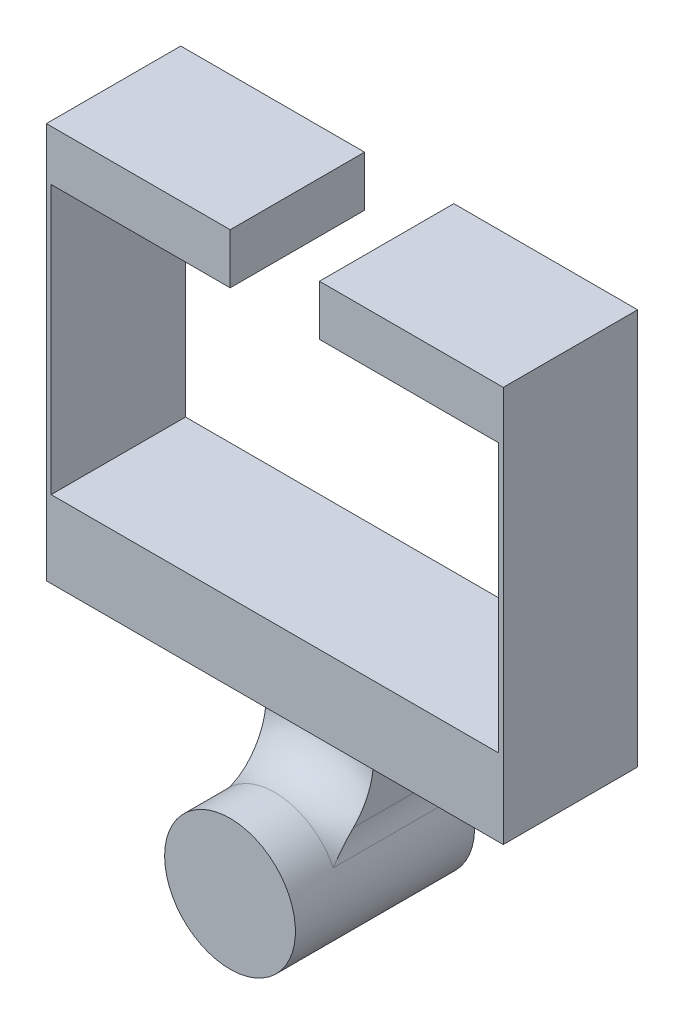
ISO-10303-21;
HEADER;
FILE_DESCRIPTION(('STEP AP214'),'2;1');
FILE_NAME('part.step','',(''),(''),'','','');
FILE_SCHEMA(('AUTOMOTIVE_DESIGN { 1 0 10303 214 1 1 1 1 }'));
ENDSEC;
DATA;
#1=APPLICATION_CONTEXT('core data for automotive mechanical design processes');
#2=APPLICATION_PROTOCOL_DEFINITION('international standard','automotive_design',2000,#1);
#3=PRODUCT_CONTEXT('',#1,'mechanical');
#4=PRODUCT('Part','Part','',(#3));
#5=PRODUCT_RELATED_PRODUCT_CATEGORY('part','',(#4));
#6=PRODUCT_DEFINITION_FORMATION('','',#4);
#7=PRODUCT_DEFINITION_CONTEXT('part definition',#1,'design');
#8=PRODUCT_DEFINITION('design','',#6,#7);
#9=PRODUCT_DEFINITION_SHAPE('','',#8);
#10=(LENGTH_UNIT() NAMED_UNIT(*) SI_UNIT(.MILLI.,.METRE.));
#11=(NAMED_UNIT(*) PLANE_ANGLE_UNIT() SI_UNIT($,.RADIAN.));
#12=(NAMED_UNIT(*) SI_UNIT($,.STERADIAN.) SOLID_ANGLE_UNIT());
#13=UNCERTAINTY_MEASURE_WITH_UNIT(LENGTH_MEASURE(1.E-05),#10,'distance_accuracy_value','');
#14=(GEOMETRIC_REPRESENTATION_CONTEXT(3) GLOBAL_UNCERTAINTY_ASSIGNED_CONTEXT((#13)) GLOBAL_UNIT_ASSIGNED_CONTEXT((#10,
#11,#12)) REPRESENTATION_CONTEXT('',''));
#15=CARTESIAN_POINT('',(0.,0.,0.));
#16=DIRECTION('',(0.,0.,1.));
#17=DIRECTION('',(1.,0.,0.));
#18=AXIS2_PLACEMENT_3D('',#15,#16,#17);
#19=CARTESIAN_POINT('',(-10.2322758787516,28.7391320706955,19.05));
#20=DIRECTION('',(0.,1.,0.));
#21=DIRECTION('',(0.,0.,1.));
#22=AXIS2_PLACEMENT_3D('',#19,#20,#21);
#23=PLANE('',#22);
#24=DIRECTION('',(0.,0.,-1.));
#25=VECTOR('',#24,1.);
#26=CARTESIAN_POINT('',(-50.2372758787516,28.7391320706955,0.));
#27=LINE('',#26,#25);
#28=CARTESIAN_POINT('',(-50.2372758787516,28.7391320706955,12.7));
#29=VERTEX_POINT('',#28);
#30=CARTESIAN_POINT('',(-50.2372758787516,28.7391320706955,0.));
#31=VERTEX_POINT('',#30);
#32=EDGE_CURVE('E212',#29,#31,#27,.T.);
#33=ORIENTED_EDGE('',*,*,#32,.F.);
#34=DIRECTION('',(-1.,0.,0.));
#35=VECTOR('',#34,1.);
#36=CARTESIAN_POINT('',(-50.2372758787516,28.7391320706955,12.7));
#37=LINE('',#36,#35);
#38=CARTESIAN_POINT('',(-34.9972758787516,28.7391320706955,12.7));
#39=VERTEX_POINT('',#38);
#40=EDGE_CURVE('E191',#39,#29,#37,.T.);
#41=ORIENTED_EDGE('',*,*,#40,.F.);
#42=DIRECTION('',(0.,0.,1.));
#43=VECTOR('',#42,1.);
#44=CARTESIAN_POINT('',(-34.9972758787516,28.7391320706955,0.));
#45=LINE('',#44,#43);
#46=CARTESIAN_POINT('',(-34.9972758787516,28.7391320706955,0.));
#47=VERTEX_POINT('',#46);
#48=EDGE_CURVE('E210',#47,#39,#45,.T.);
#49=ORIENTED_EDGE('',*,*,#48,.F.);
#50=DIRECTION('',(1.,0.,0.));
#51=VECTOR('',#50,1.);
#52=CARTESIAN_POINT('',(-10.2322758787516,28.7391320706955,0.));
#53=LINE('',#52,#51);
#54=CARTESIAN_POINT('',(-10.2322758787516,28.7391320706955,0.));
#55=VERTEX_POINT('',#54);
#56=EDGE_CURVE('E335',#47,#55,#53,.T.);
#57=ORIENTED_EDGE('',*,*,#56,.T.);
#58=DIRECTION('',(0.,0.,-1.));
#59=VECTOR('',#58,1.);
#60=CARTESIAN_POINT('',(-10.2322758787516,28.7391320706955,19.05));
#61=LINE('',#60,#59);
#62=CARTESIAN_POINT('',(-10.2322758787516,28.7391320706955,19.05));
#63=VERTEX_POINT('',#62);
#64=EDGE_CURVE('E354',#63,#55,#61,.T.);
#65=ORIENTED_EDGE('',*,*,#64,.F.);
#66=DIRECTION('',(1.,0.,0.));
#67=VECTOR('',#66,1.);
#68=CARTESIAN_POINT('',(-10.2322758787516,28.7391320706955,19.05));
#69=LINE('',#68,#67);
#70=CARTESIAN_POINT('',(-75.0022758787516,28.7391320706955,19.05));
#71=VERTEX_POINT('',#70);
#72=EDGE_CURVE('E316',#71,#63,#69,.T.);
#73=ORIENTED_EDGE('',*,*,#72,.F.);
#74=DIRECTION('',(0.,0.,-1.));
#75=VECTOR('',#74,1.);
#76=CARTESIAN_POINT('',(-75.0022758787516,28.7391320706955,19.05));
#77=LINE('',#76,#75);
#78=CARTESIAN_POINT('',(-75.0022758787516,28.7391320706955,0.));
#79=VERTEX_POINT('',#78);
#80=EDGE_CURVE('E357',#71,#79,#77,.T.);
#81=ORIENTED_EDGE('',*,*,#80,.T.);
#82=EDGE_CURVE('E337',#79,#31,#53,.T.);
#83=ORIENTED_EDGE('',*,*,#82,.T.);
#84=EDGE_LOOP('',(#33,#41,#49,#57,#65,#73,#81,#83));
#85=FACE_BOUND('',#84,.T.);
#86=ADVANCED_FACE('F47',(#85),#23,.F.);
#87=CARTESIAN_POINT('',(-75.0022758787516,84.8731320706955,19.05));
#88=DIRECTION('',(0.,-1.,0.));
#89=DIRECTION('',(0.,0.,-1.));
#90=AXIS2_PLACEMENT_3D('',#87,#88,#89);
#91=PLANE('',#90);
#92=DIRECTION('',(0.,0.,1.));
#93=VECTOR('',#92,1.);
#94=CARTESIAN_POINT('',(-48.9418758787516,84.8731320706955,0.));
#95=LINE('',#94,#93);
#96=CARTESIAN_POINT('',(-48.9418758787516,84.8731320706955,0.));
#97=VERTEX_POINT('',#96);
#98=CARTESIAN_POINT('',(-48.9418758787516,84.8731320706955,19.05));
#99=VERTEX_POINT('',#98);
#100=EDGE_CURVE('E295',#97,#99,#95,.T.);
#101=ORIENTED_EDGE('',*,*,#100,.F.);
#102=DIRECTION('',(-1.,0.,0.));
#103=VECTOR('',#102,1.);
#104=CARTESIAN_POINT('',(-75.0022758787516,84.8731320706955,0.));
#105=LINE('',#104,#103);
#106=CARTESIAN_POINT('',(-75.0022758787516,84.8731320706955,0.));
#107=VERTEX_POINT('',#106);
#108=EDGE_CURVE('E345',#97,#107,#105,.T.);
#109=ORIENTED_EDGE('',*,*,#108,.T.);
#110=DIRECTION('',(0.,0.,-1.));
#111=VECTOR('',#110,1.);
#112=CARTESIAN_POINT('',(-75.0022758787516,84.8731320706955,19.05));
#113=LINE('',#112,#111);
#114=CARTESIAN_POINT('',(-75.0022758787516,84.8731320706955,19.05));
#115=VERTEX_POINT('',#114);
#116=EDGE_CURVE('E331',#115,#107,#113,.T.);
#117=ORIENTED_EDGE('',*,*,#116,.F.);
#118=DIRECTION('',(-1.,0.,0.));
#119=VECTOR('',#118,1.);
#120=CARTESIAN_POINT('',(-75.0022758787516,84.8731320706955,19.05));
#121=LINE('',#120,#119);
#122=EDGE_CURVE('E327',#99,#115,#121,.T.);
#123=ORIENTED_EDGE('',*,*,#122,.F.);
#124=EDGE_LOOP('',(#101,#109,#117,#123));
#125=FACE_BOUND('',#124,.T.);
#126=ADVANCED_FACE('F465',(#125),#91,.F.);
#127=CARTESIAN_POINT('',(0.,0.,19.05));
#128=DIRECTION('',(0.,0.,-1.));
#129=DIRECTION('',(-1.,0.,0.));
#130=AXIS2_PLACEMENT_3D('',#127,#128,#129);
#131=PLANE('',#130);
#132=DIRECTION('',(0.,1.,0.));
#133=VECTOR('',#132,1.);
#134=CARTESIAN_POINT('',(-36.2926758787516,77.7357320706955,19.05));
#135=LINE('',#134,#133);
#136=CARTESIAN_POINT('',(-36.2926758787516,77.7357320706955,19.05));
#137=VERTEX_POINT('',#136);
#138=CARTESIAN_POINT('',(-36.2926758787516,84.8731320706955,19.05));
#139=VERTEX_POINT('',#138);
#140=EDGE_CURVE('E281',#137,#139,#135,.T.);
#141=ORIENTED_EDGE('',*,*,#140,.F.);
#142=DIRECTION('',(-1.,0.,0.));
#143=VECTOR('',#142,1.);
#144=CARTESIAN_POINT('',(-10.9129958787516,77.7357320706955,19.05));
#145=LINE('',#144,#143);
#146=CARTESIAN_POINT('',(-10.9129958787516,77.7357320706955,19.05));
#147=VERTEX_POINT('',#146);
#148=EDGE_CURVE('E278',#147,#137,#145,.T.);
#149=ORIENTED_EDGE('',*,*,#148,.F.);
#150=DIRECTION('',(0.,1.,0.));
#151=VECTOR('',#150,1.);
#152=CARTESIAN_POINT('',(-10.9129958787516,39.6611320706956,19.05));
#153=LINE('',#152,#151);
#154=CARTESIAN_POINT('',(-10.9129958787516,39.6611320706956,19.05));
#155=VERTEX_POINT('',#154);
#156=EDGE_CURVE('E277',#155,#147,#153,.T.);
#157=ORIENTED_EDGE('',*,*,#156,.F.);
#158=DIRECTION('',(1.,0.,0.));
#159=VECTOR('',#158,1.);
#160=CARTESIAN_POINT('',(-74.3215558787516,39.6611320706956,19.05));
#161=LINE('',#160,#159);
#162=CARTESIAN_POINT('',(-74.3215558787516,39.6611320706956,19.05));
#163=VERTEX_POINT('',#162);
#164=EDGE_CURVE('E275',#163,#155,#161,.T.);
#165=ORIENTED_EDGE('',*,*,#164,.F.);
#166=DIRECTION('',(0.,-1.,0.));
#167=VECTOR('',#166,1.);
#168=CARTESIAN_POINT('',(-74.3215558787516,39.6611320706956,19.05));
#169=LINE('',#168,#167);
#170=CARTESIAN_POINT('',(-74.3215558787516,77.7357320706955,19.05));
#171=VERTEX_POINT('',#170);
#172=EDGE_CURVE('E269',#171,#163,#169,.T.);
#173=ORIENTED_EDGE('',*,*,#172,.F.);
#174=DIRECTION('',(-1.,0.,0.));
#175=VECTOR('',#174,1.);
#176=CARTESIAN_POINT('',(-74.3215558787516,77.7357320706955,19.05));
#177=LINE('',#176,#175);
#178=CARTESIAN_POINT('',(-48.9418758787516,77.7357320706955,19.05));
#179=VERTEX_POINT('',#178);
#180=EDGE_CURVE('E234',#179,#171,#177,.T.);
#181=ORIENTED_EDGE('',*,*,#180,.F.);
#182=DIRECTION('',(0.,-1.,0.));
#183=VECTOR('',#182,1.);
#184=CARTESIAN_POINT('',(-48.9418758787516,77.7357320706955,19.05));
#185=LINE('',#184,#183);
#186=EDGE_CURVE('E239',#99,#179,#185,.T.);
#187=ORIENTED_EDGE('',*,*,#186,.F.);
#188=ORIENTED_EDGE('',*,*,#122,.T.);
#189=DIRECTION('',(0.,-1.,0.));
#190=VECTOR('',#189,1.);
#191=CARTESIAN_POINT('',(-75.0022758787516,28.7391320706955,19.05));
#192=LINE('',#191,#190);
#193=EDGE_CURVE('E314',#115,#71,#192,.T.);
#194=ORIENTED_EDGE('',*,*,#193,.T.);
#195=ORIENTED_EDGE('',*,*,#72,.T.);
#196=DIRECTION('',(0.,1.,0.));
#197=VECTOR('',#196,1.);
#198=CARTESIAN_POINT('',(-10.2322758787516,84.8731320706955,19.05));
#199=LINE('',#198,#197);
#200=CARTESIAN_POINT('',(-10.2322758787516,84.8731320706955,19.05));
#201=VERTEX_POINT('',#200);
#202=EDGE_CURVE('E324',#63,#201,#199,.T.);
#203=ORIENTED_EDGE('',*,*,#202,.T.);
#204=EDGE_CURVE('E329',#201,#139,#121,.T.);
#205=ORIENTED_EDGE('',*,*,#204,.T.);
#206=EDGE_LOOP('',(#141,#149,#157,#165,#173,#181,#187,#188,#194,#195,#203,#205));
#207=FACE_BOUND('',#206,.T.);
#208=ADVANCED_FACE('F444',(#207),#131,.F.);
#209=CARTESIAN_POINT('',(0.,0.,0.));
#210=DIRECTION('',(0.,0.,-1.));
#211=DIRECTION('',(-1.,0.,0.));
#212=AXIS2_PLACEMENT_3D('',#209,#210,#211);
#213=PLANE('',#212);
#214=DIRECTION('',(0.,1.,0.));
#215=VECTOR('',#214,1.);
#216=CARTESIAN_POINT('',(-34.9972758787516,9.68913207069554,0.));
#217=LINE('',#216,#215);
#218=CARTESIAN_POINT('',(-34.9972758787516,16.6787487268506,0.));
#219=VERTEX_POINT('',#218);
#220=EDGE_CURVE('E201',#219,#47,#217,.T.);
#221=ORIENTED_EDGE('',*,*,#220,.F.);
#222=CARTESIAN_POINT('',(-28.6472758787516,16.6787487268506,0.));
#223=DIRECTION('',(0.,0.,-1.));
#224=DIRECTION('',(-1.,0.,0.));
#225=AXIS2_PLACEMENT_3D('',#222,#223,#224);
#226=CIRCLE('',#225,6.35);
#227=CARTESIAN_POINT('',(-34.3261376673695,13.8374411430477,0.));
#228=VERTEX_POINT('',#227);
#229=EDGE_CURVE('E11',#219,#228,#226,.F.);
#230=ORIENTED_EDGE('',*,*,#229,.T.);
#231=CARTESIAN_POINT('',(-42.6172758787516,9.68913207069554,0.));
#232=DIRECTION('',(0.,0.,-1.));
#233=DIRECTION('',(-1.,0.,0.));
#234=AXIS2_PLACEMENT_3D('',#231,#232,#233);
#235=CIRCLE('',#234,9.271);
#236=CARTESIAN_POINT('',(-50.9084140901337,13.8374411430477,0.));
#237=VERTEX_POINT('',#236);
#238=EDGE_CURVE('E221',#228,#237,#235,.T.);
#239=ORIENTED_EDGE('',*,*,#238,.T.);
#240=CARTESIAN_POINT('',(-56.5872758787516,16.6787487268506,0.));
#241=DIRECTION('',(0.,0.,-1.));
#242=DIRECTION('',(-1.,0.,0.));
#243=AXIS2_PLACEMENT_3D('',#240,#241,#242);
#244=CIRCLE('',#243,6.35);
#245=CARTESIAN_POINT('',(-50.2372758787516,16.6787487268506,0.));
#246=VERTEX_POINT('',#245);
#247=EDGE_CURVE('E376',#237,#246,#244,.F.);
#248=ORIENTED_EDGE('',*,*,#247,.T.);
#249=DIRECTION('',(0.,1.,0.));
#250=VECTOR('',#249,1.);
#251=CARTESIAN_POINT('',(-50.2372758787516,9.68913207069554,0.));
#252=LINE('',#251,#250);
#253=EDGE_CURVE('E227',#246,#31,#252,.T.);
#254=ORIENTED_EDGE('',*,*,#253,.T.);
#255=ORIENTED_EDGE('',*,*,#82,.F.);
#256=DIRECTION('',(0.,-1.,0.));
#257=VECTOR('',#256,1.);
#258=CARTESIAN_POINT('',(-75.0022758787516,28.7391320706955,0.));
#259=LINE('',#258,#257);
#260=EDGE_CURVE('E291',#107,#79,#259,.T.);
#261=ORIENTED_EDGE('',*,*,#260,.F.);
#262=ORIENTED_EDGE('',*,*,#108,.F.);
#263=DIRECTION('',(0.,-1.,0.));
#264=VECTOR('',#263,1.);
#265=CARTESIAN_POINT('',(-48.9418758787516,77.7357320706955,0.));
#266=LINE('',#265,#264);
#267=CARTESIAN_POINT('',(-48.9418758787516,77.7357320706955,0.));
#268=VERTEX_POINT('',#267);
#269=EDGE_CURVE('E258',#97,#268,#266,.T.);
#270=ORIENTED_EDGE('',*,*,#269,.T.);
#271=DIRECTION('',(-1.,0.,0.));
#272=VECTOR('',#271,1.);
#273=CARTESIAN_POINT('',(-74.3215558787516,77.7357320706955,0.));
#274=LINE('',#273,#272);
#275=CARTESIAN_POINT('',(-74.3215558787516,77.7357320706955,0.));
#276=VERTEX_POINT('',#275);
#277=EDGE_CURVE('E232',#268,#276,#274,.T.);
#278=ORIENTED_EDGE('',*,*,#277,.T.);
#279=DIRECTION('',(0.,-1.,0.));
#280=VECTOR('',#279,1.);
#281=CARTESIAN_POINT('',(-74.3215558787516,39.6611320706956,0.));
#282=LINE('',#281,#280);
#283=CARTESIAN_POINT('',(-74.3215558787516,39.6611320706956,0.));
#284=VERTEX_POINT('',#283);
#285=EDGE_CURVE('E237',#276,#284,#282,.T.);
#286=ORIENTED_EDGE('',*,*,#285,.T.);
#287=DIRECTION('',(1.,0.,0.));
#288=VECTOR('',#287,1.);
#289=CARTESIAN_POINT('',(-74.3215558787516,39.6611320706956,0.));
#290=LINE('',#289,#288);
#291=CARTESIAN_POINT('',(-10.9129958787516,39.6611320706956,0.));
#292=VERTEX_POINT('',#291);
#293=EDGE_CURVE('E242',#284,#292,#290,.T.);
#294=ORIENTED_EDGE('',*,*,#293,.T.);
#295=DIRECTION('',(0.,1.,0.));
#296=VECTOR('',#295,1.);
#297=CARTESIAN_POINT('',(-10.9129958787516,39.6611320706956,0.));
#298=LINE('',#297,#296);
#299=CARTESIAN_POINT('',(-10.9129958787516,77.7357320706955,0.));
#300=VERTEX_POINT('',#299);
#301=EDGE_CURVE('E247',#292,#300,#298,.T.);
#302=ORIENTED_EDGE('',*,*,#301,.T.);
#303=DIRECTION('',(-1.,0.,0.));
#304=VECTOR('',#303,1.);
#305=CARTESIAN_POINT('',(-10.9129958787516,77.7357320706955,0.));
#306=LINE('',#305,#304);
#307=CARTESIAN_POINT('',(-36.2926758787516,77.7357320706955,0.));
#308=VERTEX_POINT('',#307);
#309=EDGE_CURVE('E255',#300,#308,#306,.T.);
#310=ORIENTED_EDGE('',*,*,#309,.T.);
#311=DIRECTION('',(0.,1.,0.));
#312=VECTOR('',#311,1.);
#313=CARTESIAN_POINT('',(-36.2926758787516,77.7357320706955,0.));
#314=LINE('',#313,#312);
#315=CARTESIAN_POINT('',(-36.2926758787516,84.8731320706955,0.));
#316=VERTEX_POINT('',#315);
#317=EDGE_CURVE('E257',#308,#316,#314,.T.);
#318=ORIENTED_EDGE('',*,*,#317,.T.);
#319=CARTESIAN_POINT('',(-10.2322758787516,84.8731320706955,0.));
#320=VERTEX_POINT('',#319);
#321=EDGE_CURVE('E318',#320,#316,#105,.T.);
#322=ORIENTED_EDGE('',*,*,#321,.F.);
#323=DIRECTION('',(0.,1.,0.));
#324=VECTOR('',#323,1.);
#325=CARTESIAN_POINT('',(-10.2322758787516,84.8731320706955,0.));
#326=LINE('',#325,#324);
#327=EDGE_CURVE('E339',#55,#320,#326,.T.);
#328=ORIENTED_EDGE('',*,*,#327,.F.);
#329=ORIENTED_EDGE('',*,*,#56,.F.);
#330=EDGE_LOOP('',(#221,#230,#239,#248,#254,#255,#261,#262,#270,#278,#286,#294,#302,#310,#318,
#322,#328,#329));
#331=FACE_BOUND('',#330,.T.);
#332=ADVANCED_FACE('F424',(#331),#213,.T.);
#333=CARTESIAN_POINT('',(-75.0022758787516,28.7391320706955,19.05));
#334=DIRECTION('',(1.,0.,0.));
#335=DIRECTION('',(0.,0.,-1.));
#336=AXIS2_PLACEMENT_3D('',#333,#334,#335);
#337=PLANE('',#336);
#338=ORIENTED_EDGE('',*,*,#260,.T.);
#339=ORIENTED_EDGE('',*,*,#80,.F.);
#340=ORIENTED_EDGE('',*,*,#193,.F.);
#341=ORIENTED_EDGE('',*,*,#116,.T.);
#342=EDGE_LOOP('',(#338,#339,#340,#341));
#343=FACE_BOUND('',#342,.T.);
#344=ADVANCED_FACE('F402',(#343),#337,.F.);
#345=CARTESIAN_POINT('',(-10.2322758787516,84.8731320706955,19.05));
#346=DIRECTION('',(-1.,0.,0.));
#347=DIRECTION('',(0.,0.,1.));
#348=AXIS2_PLACEMENT_3D('',#345,#346,#347);
#349=PLANE('',#348);
#350=ORIENTED_EDGE('',*,*,#327,.T.);
#351=DIRECTION('',(0.,0.,-1.));
#352=VECTOR('',#351,1.);
#353=CARTESIAN_POINT('',(-10.2322758787516,84.8731320706955,19.05));
#354=LINE('',#353,#352);
#355=EDGE_CURVE('E346',#201,#320,#354,.T.);
#356=ORIENTED_EDGE('',*,*,#355,.F.);
#357=ORIENTED_EDGE('',*,*,#202,.F.);
#358=ORIENTED_EDGE('',*,*,#64,.T.);
#359=EDGE_LOOP('',(#350,#356,#357,#358));
#360=FACE_BOUND('',#359,.T.);
#361=ADVANCED_FACE('F436',(#360),#349,.F.);
#362=ORIENTED_EDGE('',*,*,#321,.T.);
#363=DIRECTION('',(0.,0.,1.));
#364=VECTOR('',#363,1.);
#365=CARTESIAN_POINT('',(-36.2926758787516,84.8731320706955,0.));
#366=LINE('',#365,#364);
#367=EDGE_CURVE('E300',#316,#139,#366,.T.);
#368=ORIENTED_EDGE('',*,*,#367,.T.);
#369=ORIENTED_EDGE('',*,*,#204,.F.);
#370=ORIENTED_EDGE('',*,*,#355,.T.);
#371=EDGE_LOOP('',(#362,#368,#369,#370));
#372=FACE_BOUND('',#371,.T.);
#373=ADVANCED_FACE('F441',(#372),#91,.F.);
#374=CARTESIAN_POINT('',(-74.3215558787516,77.7357320706955,0.));
#375=DIRECTION('',(0.,1.,0.));
#376=DIRECTION('',(0.,0.,1.));
#377=AXIS2_PLACEMENT_3D('',#374,#375,#376);
#378=PLANE('',#377);
#379=ORIENTED_EDGE('',*,*,#180,.T.);
#380=DIRECTION('',(0.,0.,1.));
#381=VECTOR('',#380,1.);
#382=CARTESIAN_POINT('',(-74.3215558787516,77.7357320706955,0.));
#383=LINE('',#382,#381);
#384=EDGE_CURVE('E261',#276,#171,#383,.T.);
#385=ORIENTED_EDGE('',*,*,#384,.F.);
#386=ORIENTED_EDGE('',*,*,#277,.F.);
#387=DIRECTION('',(0.,0.,1.));
#388=VECTOR('',#387,1.);
#389=CARTESIAN_POINT('',(-48.9418758787516,77.7357320706955,0.));
#390=LINE('',#389,#388);
#391=EDGE_CURVE('E290',#268,#179,#390,.T.);
#392=ORIENTED_EDGE('',*,*,#391,.T.);
#393=EDGE_LOOP('',(#379,#385,#386,#392));
#394=FACE_BOUND('',#393,.T.);
#395=ADVANCED_FACE('F479',(#394),#378,.F.);
#396=CARTESIAN_POINT('',(-48.9418758787516,77.7357320706955,0.));
#397=DIRECTION('',(-1.,0.,0.));
#398=DIRECTION('',(0.,0.,1.));
#399=AXIS2_PLACEMENT_3D('',#396,#397,#398);
#400=PLANE('',#399);
#401=ORIENTED_EDGE('',*,*,#186,.T.);
#402=ORIENTED_EDGE('',*,*,#391,.F.);
#403=ORIENTED_EDGE('',*,*,#269,.F.);
#404=ORIENTED_EDGE('',*,*,#100,.T.);
#405=EDGE_LOOP('',(#401,#402,#403,#404));
#406=FACE_BOUND('',#405,.T.);
#407=ADVANCED_FACE('F483',(#406),#400,.F.);
#408=CARTESIAN_POINT('',(-36.2926758787516,77.7357320706955,0.));
#409=DIRECTION('',(1.,0.,0.));
#410=DIRECTION('',(0.,0.,-1.));
#411=AXIS2_PLACEMENT_3D('',#408,#409,#410);
#412=PLANE('',#411);
#413=ORIENTED_EDGE('',*,*,#140,.T.);
#414=ORIENTED_EDGE('',*,*,#367,.F.);
#415=ORIENTED_EDGE('',*,*,#317,.F.);
#416=DIRECTION('',(0.,0.,1.));
#417=VECTOR('',#416,1.);
#418=CARTESIAN_POINT('',(-36.2926758787516,77.7357320706955,0.));
#419=LINE('',#418,#417);
#420=EDGE_CURVE('E301',#308,#137,#419,.T.);
#421=ORIENTED_EDGE('',*,*,#420,.T.);
#422=EDGE_LOOP('',(#413,#414,#415,#421));
#423=FACE_BOUND('',#422,.T.);
#424=ADVANCED_FACE('F499',(#423),#412,.F.);
#425=CARTESIAN_POINT('',(-10.9129958787516,77.7357320706955,0.));
#426=DIRECTION('',(0.,1.,0.));
#427=DIRECTION('',(0.,0.,1.));
#428=AXIS2_PLACEMENT_3D('',#425,#426,#427);
#429=PLANE('',#428);
#430=ORIENTED_EDGE('',*,*,#148,.T.);
#431=ORIENTED_EDGE('',*,*,#420,.F.);
#432=ORIENTED_EDGE('',*,*,#309,.F.);
#433=DIRECTION('',(0.,0.,1.));
#434=VECTOR('',#433,1.);
#435=CARTESIAN_POINT('',(-10.9129958787516,77.7357320706955,0.));
#436=LINE('',#435,#434);
#437=EDGE_CURVE('E302',#300,#147,#436,.T.);
#438=ORIENTED_EDGE('',*,*,#437,.T.);
#439=EDGE_LOOP('',(#430,#431,#432,#438));
#440=FACE_BOUND('',#439,.T.);
#441=ADVANCED_FACE('F496',(#440),#429,.F.);
#442=CARTESIAN_POINT('',(-10.9129958787516,39.6611320706956,0.));
#443=DIRECTION('',(1.,0.,0.));
#444=DIRECTION('',(0.,0.,-1.));
#445=AXIS2_PLACEMENT_3D('',#442,#443,#444);
#446=PLANE('',#445);
#447=ORIENTED_EDGE('',*,*,#156,.T.);
#448=ORIENTED_EDGE('',*,*,#437,.F.);
#449=ORIENTED_EDGE('',*,*,#301,.F.);
#450=DIRECTION('',(0.,0.,1.));
#451=VECTOR('',#450,1.);
#452=CARTESIAN_POINT('',(-10.9129958787516,39.6611320706956,0.));
#453=LINE('',#452,#451);
#454=EDGE_CURVE('E310',#292,#155,#453,.T.);
#455=ORIENTED_EDGE('',*,*,#454,.T.);
#456=EDGE_LOOP('',(#447,#448,#449,#455));
#457=FACE_BOUND('',#456,.T.);
#458=ADVANCED_FACE('F495',(#457),#446,.F.);
#459=CARTESIAN_POINT('',(-74.3215558787516,39.6611320706956,0.));
#460=DIRECTION('',(0.,-1.,0.));
#461=DIRECTION('',(0.,0.,-1.));
#462=AXIS2_PLACEMENT_3D('',#459,#460,#461);
#463=PLANE('',#462);
#464=ORIENTED_EDGE('',*,*,#164,.T.);
#465=ORIENTED_EDGE('',*,*,#454,.F.);
#466=ORIENTED_EDGE('',*,*,#293,.F.);
#467=DIRECTION('',(0.,0.,1.));
#468=VECTOR('',#467,1.);
#469=CARTESIAN_POINT('',(-74.3215558787516,39.6611320706956,0.));
#470=LINE('',#469,#468);
#471=EDGE_CURVE('E309',#284,#163,#470,.T.);
#472=ORIENTED_EDGE('',*,*,#471,.T.);
#473=EDGE_LOOP('',(#464,#465,#466,#472));
#474=FACE_BOUND('',#473,.T.);
#475=ADVANCED_FACE('F486',(#474),#463,.F.);
#476=CARTESIAN_POINT('',(-74.3215558787516,39.6611320706956,0.));
#477=DIRECTION('',(-1.,0.,0.));
#478=DIRECTION('',(0.,0.,1.));
#479=AXIS2_PLACEMENT_3D('',#476,#477,#478);
#480=PLANE('',#479);
#481=ORIENTED_EDGE('',*,*,#172,.T.);
#482=ORIENTED_EDGE('',*,*,#471,.F.);
#483=ORIENTED_EDGE('',*,*,#285,.F.);
#484=ORIENTED_EDGE('',*,*,#384,.T.);
#485=EDGE_LOOP('',(#481,#482,#483,#484));
#486=FACE_BOUND('',#485,.T.);
#487=ADVANCED_FACE('F488',(#486),#480,.F.);
#488=CARTESIAN_POINT('',(-34.9972758787516,9.68913207069554,0.));
#489=DIRECTION('',(-1.,0.,0.));
#490=DIRECTION('',(0.,0.,1.));
#491=AXIS2_PLACEMENT_3D('',#488,#489,#490);
#492=PLANE('',#491);
#493=CARTESIAN_POINT('',(-34.9972758787516,23.3255260588436,12.7));
#494=CARTESIAN_POINT('',(-34.9972758787516,23.0546321355945,12.6999788290273));
#495=CARTESIAN_POINT('',(-34.9972758787516,22.7838526435306,12.7132063184054));
#496=CARTESIAN_POINT('',(-34.9972758787516,22.2449042782785,12.7648273092837));
#497=CARTESIAN_POINT('',(-34.9972758787516,21.9767334930772,12.803200706323));
#498=CARTESIAN_POINT('',(-34.9972758787516,21.4450696170849,12.9037627512357));
#499=CARTESIAN_POINT('',(-34.9972758787516,21.1815743886563,12.9659402063028));
#500=CARTESIAN_POINT('',(-34.9972758787516,20.6608961173988,13.1127576440594));
#501=CARTESIAN_POINT('',(-34.9972758787516,20.4037139399197,13.1974006876012));
#502=CARTESIAN_POINT('',(-34.9972758787516,19.913776222446,13.3816466778445));
#503=CARTESIAN_POINT('',(-34.9972758787516,19.6805188653102,13.4799215790636));
#504=CARTESIAN_POINT('',(-34.9972758787516,19.2221823018147,13.6939966569016));
#505=CARTESIAN_POINT('',(-34.9972758787516,18.9971033824517,13.8097974478017));
#506=CARTESIAN_POINT('',(-34.9972758787516,18.5566558722049,14.0579344043023));
#507=CARTESIAN_POINT('',(-34.9972758787516,18.3412746890758,14.1902482331328));
#508=CARTESIAN_POINT('',(-34.9972758787516,17.9213118616131,14.4708916037341));
#509=CARTESIAN_POINT('',(-34.9972758787516,17.7167257486073,14.6192144398188));
#510=CARTESIAN_POINT('',(-34.9972758787516,17.3708588639981,14.8914797414496));
#511=CARTESIAN_POINT('',(-34.9972758787516,17.2268062231467,15.0119101167732));
#512=CARTESIAN_POINT('',(-34.9972758787516,16.9466487929082,15.2613205388803));
#513=CARTESIAN_POINT('',(-34.9972758787516,16.8105338864013,15.3902892343684));
#514=CARTESIAN_POINT('',(-34.9972758787516,16.6787487268506,15.523621196131));
#515=B_SPLINE_CURVE_WITH_KNOTS('',3,(#493,#494,#495,#496,#497,#498,#499,#500,#501,#502,#503,
#504,#505,#506,#507,#508,#509,#510,#511,#512,#513,#514),.UNSPECIFIED.,.F.,.F.,(4,2,2,2,2,2,2,2,
2,2,4),(0.,0.812193431689651,1.62373829576261,2.43490203447489,3.24617634798989,4.0047792486576,
4.7634087444633,5.52102296311216,6.27832106279377,6.84126734956655,7.40347969778935),.UNSPECIFIED.);
#516=CARTESIAN_POINT('',(-34.9972758787516,23.3255260588436,12.7));
#517=VERTEX_POINT('',#516);
#518=CARTESIAN_POINT('',(-34.9972758787516,16.6787487268506,15.523621196131));
#519=VERTEX_POINT('',#518);
#520=EDGE_CURVE('E378',#517,#519,#515,.T.);
#521=ORIENTED_EDGE('',*,*,#520,.T.);
#522=DIRECTION('',(0.,0.,-1.));
#523=VECTOR('',#522,1.);
#524=CARTESIAN_POINT('',(-34.9972758787516,16.6787487268506,0.));
#525=LINE('',#524,#523);
#526=EDGE_CURVE('E74',#519,#219,#525,.T.);
#527=ORIENTED_EDGE('',*,*,#526,.T.);
#528=ORIENTED_EDGE('',*,*,#220,.T.);
#529=ORIENTED_EDGE('',*,*,#48,.T.);
#530=DIRECTION('',(0.,1.,0.));
#531=VECTOR('',#530,1.);
#532=CARTESIAN_POINT('',(-34.9972758787516,9.68913207069554,12.7));
#533=LINE('',#532,#531);
#534=EDGE_CURVE('E188',#517,#39,#533,.T.);
#535=ORIENTED_EDGE('',*,*,#534,.F.);
#536=EDGE_LOOP('',(#521,#527,#528,#529,#535));
#537=FACE_BOUND('',#536,.T.);
#538=ADVANCED_FACE('F211',(#537),#492,.F.);
#539=CARTESIAN_POINT('',(-50.2372758787516,9.68913207069554,12.7));
#540=DIRECTION('',(0.,0.,-1.));
#541=DIRECTION('',(-1.,0.,0.));
#542=AXIS2_PLACEMENT_3D('',#539,#540,#541);
#543=PLANE('',#542);
#544=DIRECTION('',(0.,1.,0.));
#545=VECTOR('',#544,1.);
#546=CARTESIAN_POINT('',(-50.2372758787516,9.68913207069554,12.7));
#547=LINE('',#546,#545);
#548=CARTESIAN_POINT('',(-50.2372758787516,23.3255260588436,12.7));
#549=VERTEX_POINT('',#548);
#550=EDGE_CURVE('E202',#549,#29,#547,.T.);
#551=ORIENTED_EDGE('',*,*,#550,.F.);
#552=CARTESIAN_POINT('',(-42.6172758787516,9.68913207069554,12.7));
#553=DIRECTION('',(0.,0.,-1.));
#554=DIRECTION('',(-1.,0.,0.));
#555=AXIS2_PLACEMENT_3D('',#552,#553,#554);
#556=CIRCLE('',#555,15.621);
#557=EDGE_CURVE('E197',#549,#517,#556,.T.);
#558=ORIENTED_EDGE('',*,*,#557,.T.);
#559=ORIENTED_EDGE('',*,*,#534,.T.);
#560=ORIENTED_EDGE('',*,*,#40,.T.);
#561=EDGE_LOOP('',(#551,#558,#559,#560));
#562=FACE_BOUND('',#561,.T.);
#563=ADVANCED_FACE('F194',(#562),#543,.F.);
#564=CARTESIAN_POINT('',(-50.2372758787516,9.68913207069554,0.));
#565=DIRECTION('',(1.,0.,0.));
#566=DIRECTION('',(0.,0.,-1.));
#567=AXIS2_PLACEMENT_3D('',#564,#565,#566);
#568=PLANE('',#567);
#569=ORIENTED_EDGE('',*,*,#253,.F.);
#570=DIRECTION('',(0.,0.,-1.));
#571=VECTOR('',#570,1.);
#572=CARTESIAN_POINT('',(-50.2372758787516,16.6787487268506,0.));
#573=LINE('',#572,#571);
#574=CARTESIAN_POINT('',(-50.2372758787516,16.6787487268506,15.523621196131));
#575=VERTEX_POINT('',#574);
#576=EDGE_CURVE('E82',#246,#575,#573,.F.);
#577=ORIENTED_EDGE('',*,*,#576,.T.);
#578=CARTESIAN_POINT('',(-50.2372758787516,16.6787487268506,15.523621196131));
#579=CARTESIAN_POINT('',(-50.2372758787516,16.7734021785488,15.4278261411111));
#580=CARTESIAN_POINT('',(-50.2372758787516,16.8703182735625,15.3342880702086));
#581=CARTESIAN_POINT('',(-50.2372758787516,17.0682785837536,15.1517193439985));
#582=CARTESIAN_POINT('',(-50.2372758787516,17.1693220826402,15.0626879125406));
#583=CARTESIAN_POINT('',(-50.2372758787516,17.3751281763483,14.8891306286555));
#584=CARTESIAN_POINT('',(-50.2372758787516,17.4798891319186,14.8046028304448));
#585=CARTESIAN_POINT('',(-50.2372758787516,17.6928714796219,14.6400299743962));
#586=CARTESIAN_POINT('',(-50.2372758787516,17.801093057279,14.5599851575263));
#587=CARTESIAN_POINT('',(-50.2372758787516,18.1316476937774,14.3258582052204));
#588=CARTESIAN_POINT('',(-50.2372758787516,18.358880520139,14.1786151833996));
#589=CARTESIAN_POINT('',(-50.2372758787516,18.8245218783206,13.9030097698479));
#590=CARTESIAN_POINT('',(-50.2372758787516,19.0629321074188,13.7746502578856));
#591=CARTESIAN_POINT('',(-50.2372758787516,19.5483973734317,13.5382556757826));
#592=CARTESIAN_POINT('',(-50.2372758787516,19.7954116531375,13.4301370674651));
#593=CARTESIAN_POINT('',(-50.2372758787516,20.2975585362962,13.2347076614813));
#594=CARTESIAN_POINT('',(-50.2372758787516,20.552691198908,13.1473970154826));
#595=CARTESIAN_POINT('',(-50.2372758787516,21.0685704311247,12.9951375427789));
#596=CARTESIAN_POINT('',(-50.2372758787516,21.3292937979512,12.9301102618806));
#597=CARTESIAN_POINT('',(-50.2372758787516,21.8554232843219,12.8233343813328));
#598=CARTESIAN_POINT('',(-50.2372758787516,22.1208275522738,12.7815767810565));
#599=CARTESIAN_POINT('',(-50.2372758787516,22.5432677436248,12.7348863882157));
#600=CARTESIAN_POINT('',(-50.2372758787516,22.6994433457459,12.7218606617916));
#601=CARTESIAN_POINT('',(-50.2372758787516,23.0122437096881,12.7044179953703));
#602=CARTESIAN_POINT('',(-50.2372758787516,23.1688683833198,12.699999467445));
#603=CARTESIAN_POINT('',(-50.2372758787516,23.3255260588436,12.7));
#604=B_SPLINE_CURVE_WITH_KNOTS('',3,(#578,#579,#580,#581,#582,#583,#584,#585,#586,#587,#588,
#589,#590,#591,#592,#593,#594,#595,#596,#597,#598,#599,#600,#601,#602,#603),.UNSPECIFIED.,.F.,
.F.,(4,2,2,2,2,2,2,2,2,2,2,2,4),(0.,0.403948885387974,0.807827962822364,1.21153110626174,
1.61525592865209,2.42657274054092,3.23801315170087,4.04602696861303,4.85404667489603,
5.65919159061589,6.46402486270011,6.93396340352681,7.40381523794231),.UNSPECIFIED.);
#605=EDGE_CURVE('E63',#575,#549,#604,.T.);
#606=ORIENTED_EDGE('',*,*,#605,.T.);
#607=ORIENTED_EDGE('',*,*,#550,.T.);
#608=ORIENTED_EDGE('',*,*,#32,.T.);
#609=EDGE_LOOP('',(#569,#577,#606,#607,#608));
#610=FACE_BOUND('',#609,.T.);
#611=ADVANCED_FACE('F454',(#610),#568,.F.);
#612=CARTESIAN_POINT('',(-42.6172758787516,9.68913207069554,25.4));
#613=DIRECTION('',(0.,0.,-1.));
#614=DIRECTION('',(-1.,0.,0.));
#615=AXIS2_PLACEMENT_3D('',#612,#613,#614);
#616=CYLINDRICAL_SURFACE('',#615,9.271);
#617=CARTESIAN_POINT('',(-42.6172758787516,9.68913207069554,25.4));
#618=DIRECTION('',(0.,0.,-1.));
#619=DIRECTION('',(-1.,0.,0.));
#620=AXIS2_PLACEMENT_3D('',#617,#618,#619);
#621=CIRCLE('',#620,9.271);
#622=CARTESIAN_POINT('',(-51.8882758787516,9.68913207069554,25.4));
#623=VERTEX_POINT('',#622);
#624=EDGE_CURVE('E219',#623,#623,#621,.T.);
#625=ORIENTED_EDGE('',*,*,#624,.T.);
#626=EDGE_LOOP('',(#625));
#627=FACE_BOUND('',#626,.T.);
#628=CARTESIAN_POINT('',(-42.6172758787516,9.68913207069554,19.05));
#629=DIRECTION('',(0.,0.,-1.));
#630=DIRECTION('',(-1.,0.,0.));
#631=AXIS2_PLACEMENT_3D('',#628,#629,#630);
#632=CIRCLE('',#631,9.271);
#633=CARTESIAN_POINT('',(-34.3261376673695,13.8374411430477,19.05));
#634=VERTEX_POINT('',#633);
#635=CARTESIAN_POINT('',(-50.9084140901337,13.8374411430477,19.05));
#636=VERTEX_POINT('',#635);
#637=EDGE_CURVE('E366',#634,#636,#632,.F.);
#638=ORIENTED_EDGE('',*,*,#637,.T.);
#639=DIRECTION('',(0.,0.,-1.));
#640=VECTOR('',#639,1.);
#641=CARTESIAN_POINT('',(-50.9084140901337,13.8374411430477,25.4));
#642=LINE('',#641,#640);
#643=EDGE_CURVE('E367',#636,#237,#642,.T.);
#644=ORIENTED_EDGE('',*,*,#643,.T.);
#645=ORIENTED_EDGE('',*,*,#238,.F.);
#646=DIRECTION('',(0.,0.,-1.));
#647=VECTOR('',#646,1.);
#648=CARTESIAN_POINT('',(-34.3261376673695,13.8374411430477,25.4));
#649=LINE('',#648,#647);
#650=EDGE_CURVE('E361',#228,#634,#649,.F.);
#651=ORIENTED_EDGE('',*,*,#650,.T.);
#652=EDGE_LOOP('',(#638,#644,#645,#651));
#653=FACE_BOUND('',#652,.T.);
#654=ADVANCED_FACE('F453',(#627,#653),#616,.T.);
#655=CARTESIAN_POINT('',(-42.6172758787516,9.68913207069554,25.4));
#656=DIRECTION('',(0.,0.,-1.));
#657=DIRECTION('',(-1.,0.,0.));
#658=AXIS2_PLACEMENT_3D('',#655,#656,#657);
#659=PLANE('',#658);
#660=ORIENTED_EDGE('',*,*,#624,.F.);
#661=EDGE_LOOP('',(#660));
#662=FACE_BOUND('',#661,.T.);
#663=ADVANCED_FACE('F458',(#662),#659,.F.);
#664=CARTESIAN_POINT('',(-28.6472758787516,16.6787487268506,25.4));
#665=DIRECTION('',(0.,0.,-1.));
#666=DIRECTION('',(-1.,0.,0.));
#667=AXIS2_PLACEMENT_3D('',#664,#665,#666);
#668=CYLINDRICAL_SURFACE('',#667,6.35);
#669=ORIENTED_EDGE('',*,*,#526,.F.);
#670=CARTESIAN_POINT('',(-34.9972758787516,16.6787487268506,15.523621196131));
#671=CARTESIAN_POINT('',(-34.9972514587445,16.5463223556792,15.6576803786264));
#672=CARTESIAN_POINT('',(-34.9931335706866,16.4161298066299,15.7938755393006));
#673=CARTESIAN_POINT('',(-34.9773648183188,16.160101413759,16.0697676236391));
#674=CARTESIAN_POINT('',(-34.9657174846586,16.0342635570902,16.2094628765705));
#675=CARTESIAN_POINT('',(-34.935558964341,15.7868444250169,16.4915584470479));
#676=CARTESIAN_POINT('',(-34.9170552552978,15.6652586697504,16.6339556578869));
#677=CARTESIAN_POINT('',(-34.8736561504485,15.4259656223462,16.9210307777036));
#678=CARTESIAN_POINT('',(-34.8487599188414,15.3082588396437,17.06570898259));
#679=CARTESIAN_POINT('',(-34.7634526543635,14.9538767099398,17.5108122039476));
#680=CARTESIAN_POINT('',(-34.6933326489584,14.7230722408492,17.8140895588051));
#681=CARTESIAN_POINT('',(-34.529532369862,14.2749134558057,18.4240596932095));
#682=CARTESIAN_POINT('',(-34.4358562755112,14.0575567624523,18.7307518576827));
#683=CARTESIAN_POINT('',(-34.3290368033347,13.8432411608557,19.0415831559954));
#684=CARTESIAN_POINT('',(-34.3275883369901,13.8403405931849,19.0457915868575));
#685=CARTESIAN_POINT('',(-34.3261376673695,13.8374411430477,19.05));
#686=B_SPLINE_CURVE_WITH_KNOTS('',3,(#670,#671,#672,#673,#674,#675,#676,#677,#678,#679,#680,
#681,#682,#683,#684,#685),.UNSPECIFIED.,.F.,.F.,(4,2,2,2,2,2,2,4),(0.,0.565169268865632,
1.13007371495809,1.69436387672454,2.25872785514616,3.4201146646477,4.58129556515777,
4.59723294434906),.UNSPECIFIED.);
#687=EDGE_CURVE('E53',#634,#519,#686,.F.);
#688=ORIENTED_EDGE('',*,*,#687,.F.);
#689=ORIENTED_EDGE('',*,*,#650,.F.);
#690=ORIENTED_EDGE('',*,*,#229,.F.);
#691=EDGE_LOOP('',(#669,#688,#689,#690));
#692=FACE_BOUND('',#691,.T.);
#693=ADVANCED_FACE('F51',(#692),#668,.F.);
#694=CARTESIAN_POINT('',(-42.6172758787516,9.68913207069554,19.05));
#695=DIRECTION('',(0.,0.,-1.));
#696=DIRECTION('',(-1.,0.,0.));
#697=AXIS2_PLACEMENT_3D('',#694,#695,#696);
#698=TOROIDAL_SURFACE('',#697,15.621,6.35);
#699=ORIENTED_EDGE('',*,*,#557,.F.);
#700=ORIENTED_EDGE('',*,*,#605,.F.);
#701=CARTESIAN_POINT('',(-50.2372758787516,16.6787487268506,15.523621196131));
#702=CARTESIAN_POINT('',(-50.2373002987586,16.5463223556792,15.6576803786264));
#703=CARTESIAN_POINT('',(-50.2414181868166,16.4161298066299,15.7938755393006));
#704=CARTESIAN_POINT('',(-50.2571869391843,16.160101413759,16.0697676236391));
#705=CARTESIAN_POINT('',(-50.2688342728445,16.0342635570902,16.2094628765705));
#706=CARTESIAN_POINT('',(-50.2989927931621,15.7868444250169,16.4915584470479));
#707=CARTESIAN_POINT('',(-50.3174965022053,15.6652586697504,16.6339556578869));
#708=CARTESIAN_POINT('',(-50.3608956070546,15.4259656223462,16.9210307777036));
#709=CARTESIAN_POINT('',(-50.3857918386617,15.3082588396437,17.06570898259));
#710=CARTESIAN_POINT('',(-50.4710991031397,14.9538767099398,17.5108122039476));
#711=CARTESIAN_POINT('',(-50.5412191085447,14.7230722408492,17.8140895588051));
#712=CARTESIAN_POINT('',(-50.7050193876411,14.2749134558057,18.4240596932095));
#713=CARTESIAN_POINT('',(-50.7986954819919,14.0575567624523,18.7307518576827));
#714=CARTESIAN_POINT('',(-50.9055149541685,13.8432411608557,19.0415831559954));
#715=CARTESIAN_POINT('',(-50.906963420513,13.8403405931849,19.0457915868575));
#716=CARTESIAN_POINT('',(-50.9084140901337,13.8374411430477,19.05));
#717=B_SPLINE_CURVE_WITH_KNOTS('',3,(#701,#702,#703,#704,#705,#706,#707,#708,#709,#710,#711,
#712,#713,#714,#715,#716),.UNSPECIFIED.,.F.,.F.,(4,2,2,2,2,2,2,4),(0.,0.565169268865632,
1.13007371495809,1.69436387672454,2.25872785514616,3.4201146646477,4.58129556515777,
4.59723294434906),.UNSPECIFIED.);
#718=EDGE_CURVE('E407',#636,#575,#717,.F.);
#719=ORIENTED_EDGE('',*,*,#718,.F.);
#720=ORIENTED_EDGE('',*,*,#637,.F.);
#721=ORIENTED_EDGE('',*,*,#687,.T.);
#722=ORIENTED_EDGE('',*,*,#520,.F.);
#723=EDGE_LOOP('',(#699,#700,#719,#720,#721,#722));
#724=FACE_BOUND('',#723,.T.);
#725=ADVANCED_FACE('F393',(#724),#698,.F.);
#726=CARTESIAN_POINT('',(-56.5872758787516,16.6787487268506,25.4));
#727=DIRECTION('',(0.,0.,-1.));
#728=DIRECTION('',(-1.,0.,0.));
#729=AXIS2_PLACEMENT_3D('',#726,#727,#728);
#730=CYLINDRICAL_SURFACE('',#729,6.35);
#731=ORIENTED_EDGE('',*,*,#247,.F.);
#732=ORIENTED_EDGE('',*,*,#643,.F.);
#733=ORIENTED_EDGE('',*,*,#718,.T.);
#734=ORIENTED_EDGE('',*,*,#576,.F.);
#735=EDGE_LOOP('',(#731,#732,#733,#734));
#736=FACE_BOUND('',#735,.T.);
#737=ADVANCED_FACE('F398',(#736),#730,.F.);
#738=CLOSED_SHELL('',(#86,#126,#208,#332,#344,#361,#373,#395,#407,#424,#441,#458,#475,#487,#538,
#563,#611,#654,#663,#693,#725,#737));
#739=MANIFOLD_SOLID_BREP('B2',#738);
#740=ADVANCED_BREP_SHAPE_REPRESENTATION('',(#18,#739),#14);
#741=SHAPE_DEFINITION_REPRESENTATION(#9,#740);
ENDSEC;
END-ISO-10303-21;
